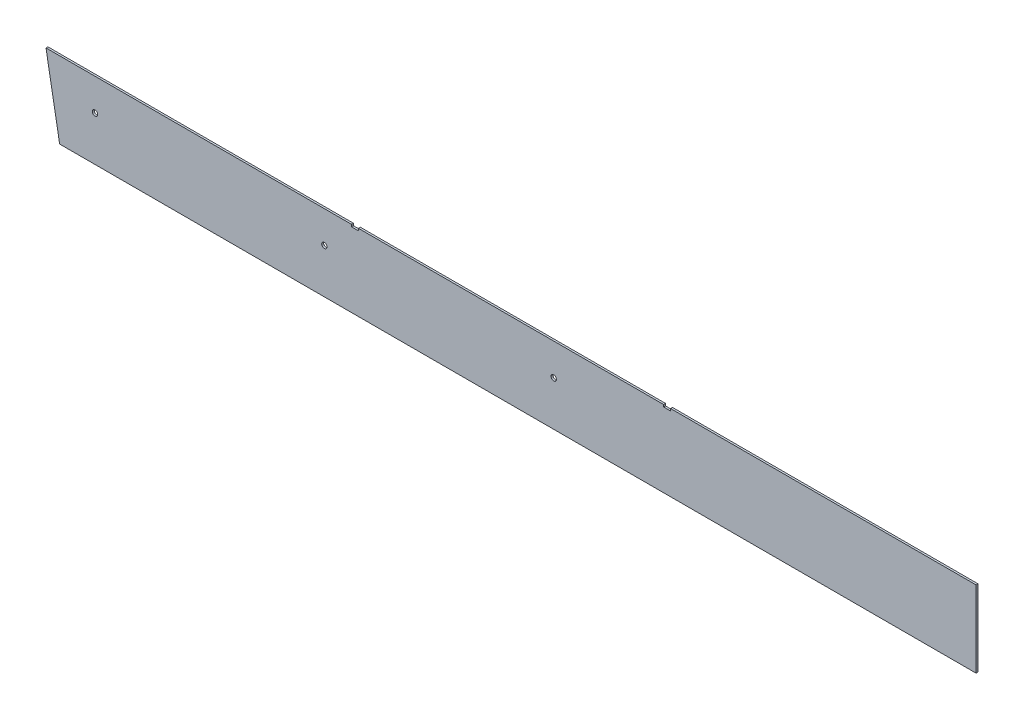
ISO-10303-21;
HEADER;
FILE_DESCRIPTION(('STEP AP214'),'2;1');
FILE_NAME('part.step','',(''),(''),'','','');
FILE_SCHEMA(('AUTOMOTIVE_DESIGN { 1 0 10303 214 1 1 1 1 }'));
ENDSEC;
DATA;
#1=APPLICATION_CONTEXT('core data for automotive mechanical design processes');
#2=APPLICATION_PROTOCOL_DEFINITION('international standard','automotive_design',2000,#1);
#3=PRODUCT_CONTEXT('',#1,'mechanical');
#4=PRODUCT('Part','Part','',(#3));
#5=PRODUCT_RELATED_PRODUCT_CATEGORY('part','',(#4));
#6=PRODUCT_DEFINITION_FORMATION('','',#4);
#7=PRODUCT_DEFINITION_CONTEXT('part definition',#1,'design');
#8=PRODUCT_DEFINITION('design','',#6,#7);
#9=PRODUCT_DEFINITION_SHAPE('','',#8);
#10=(LENGTH_UNIT() NAMED_UNIT(*) SI_UNIT(.MILLI.,.METRE.));
#11=(NAMED_UNIT(*) PLANE_ANGLE_UNIT() SI_UNIT($,.RADIAN.));
#12=(NAMED_UNIT(*) SI_UNIT($,.STERADIAN.) SOLID_ANGLE_UNIT());
#13=UNCERTAINTY_MEASURE_WITH_UNIT(LENGTH_MEASURE(1.E-05),#10,'distance_accuracy_value','');
#14=(GEOMETRIC_REPRESENTATION_CONTEXT(3) GLOBAL_UNCERTAINTY_ASSIGNED_CONTEXT((#13)) GLOBAL_UNIT_ASSIGNED_CONTEXT((#10,
#11,#12)) REPRESENTATION_CONTEXT('',''));
#15=CARTESIAN_POINT('',(0.,0.,0.));
#16=DIRECTION('',(0.,0.,1.));
#17=DIRECTION('',(1.,0.,0.));
#18=AXIS2_PLACEMENT_3D('',#15,#16,#17);
#19=CARTESIAN_POINT('',(-584.25,500.,50.));
#20=DIRECTION('',(0.,-1.,0.));
#21=DIRECTION('',(0.,0.,-1.));
#22=AXIS2_PLACEMENT_3D('',#19,#20,#21);
#23=PLANE('',#22);
#24=DIRECTION('',(0.,0.,1.));
#25=VECTOR('',#24,1.);
#26=CARTESIAN_POINT('',(-224.45,500.,50.));
#27=LINE('',#26,#25);
#28=CARTESIAN_POINT('',(-224.45,500.,0.));
#29=VERTEX_POINT('',#28);
#30=CARTESIAN_POINT('',(-224.45,500.,1.5));
#31=VERTEX_POINT('',#30);
#32=EDGE_CURVE('E213',#29,#31,#27,.T.);
#33=ORIENTED_EDGE('',*,*,#32,.F.);
#34=DIRECTION('',(1.,0.,0.));
#35=VECTOR('',#34,1.);
#36=CARTESIAN_POINT('',(-584.25,500.,0.));
#37=LINE('',#36,#35);
#38=CARTESIAN_POINT('',(-464.25,500.,0.));
#39=VERTEX_POINT('',#38);
#40=EDGE_CURVE('E186',#39,#29,#37,.T.);
#41=ORIENTED_EDGE('',*,*,#40,.F.);
#42=DIRECTION('',(0.,0.,1.));
#43=VECTOR('',#42,1.);
#44=CARTESIAN_POINT('',(-464.25,500.,50.));
#45=LINE('',#44,#43);
#46=CARTESIAN_POINT('',(-464.25,500.,1.5));
#47=VERTEX_POINT('',#46);
#48=EDGE_CURVE('E194',#39,#47,#45,.T.);
#49=ORIENTED_EDGE('',*,*,#48,.T.);
#50=DIRECTION('',(-1.,0.,0.));
#51=VECTOR('',#50,1.);
#52=CARTESIAN_POINT('',(-584.25,500.,1.5));
#53=LINE('',#52,#51);
#54=EDGE_CURVE('E191',#31,#47,#53,.T.);
#55=ORIENTED_EDGE('',*,*,#54,.F.);
#56=EDGE_LOOP('',(#33,#41,#49,#55));
#57=FACE_BOUND('',#56,.T.);
#58=ADVANCED_FACE('F42',(#57),#23,.F.);
#59=DIRECTION('',(0.,0.,-1.));
#60=VECTOR('',#59,1.);
#61=CARTESIAN_POINT('',(-219.05,500.,50.));
#62=LINE('',#61,#60);
#63=CARTESIAN_POINT('',(-219.05,500.,1.5));
#64=VERTEX_POINT('',#63);
#65=CARTESIAN_POINT('',(-219.05,500.,0.));
#66=VERTEX_POINT('',#65);
#67=EDGE_CURVE('E299',#64,#66,#62,.T.);
#68=ORIENTED_EDGE('',*,*,#67,.F.);
#69=CARTESIAN_POINT('',(20.5499999999999,500.,1.5));
#70=VERTEX_POINT('',#69);
#71=EDGE_CURVE('E178',#70,#64,#53,.T.);
#72=ORIENTED_EDGE('',*,*,#71,.F.);
#73=DIRECTION('',(0.,0.,1.));
#74=VECTOR('',#73,1.);
#75=CARTESIAN_POINT('',(20.55,500.,50.));
#76=LINE('',#75,#74);
#77=CARTESIAN_POINT('',(20.5499999999999,500.,0.));
#78=VERTEX_POINT('',#77);
#79=EDGE_CURVE('E297',#78,#70,#76,.T.);
#80=ORIENTED_EDGE('',*,*,#79,.F.);
#81=EDGE_CURVE('E184',#66,#78,#37,.T.);
#82=ORIENTED_EDGE('',*,*,#81,.F.);
#83=EDGE_LOOP('',(#68,#72,#80,#82));
#84=FACE_BOUND('',#83,.T.);
#85=ADVANCED_FACE('F316',(#84),#23,.F.);
#86=DIRECTION('',(0.,0.,-1.));
#87=VECTOR('',#86,1.);
#88=CARTESIAN_POINT('',(25.9499999999999,500.,50.));
#89=LINE('',#88,#87);
#90=CARTESIAN_POINT('',(25.9499999999999,500.,1.5));
#91=VERTEX_POINT('',#90);
#92=CARTESIAN_POINT('',(25.9499999999999,500.,0.));
#93=VERTEX_POINT('',#92);
#94=EDGE_CURVE('E279',#91,#93,#89,.T.);
#95=ORIENTED_EDGE('',*,*,#94,.F.);
#96=CARTESIAN_POINT('',(265.75,500.,1.5));
#97=VERTEX_POINT('',#96);
#98=EDGE_CURVE('E215',#97,#91,#53,.T.);
#99=ORIENTED_EDGE('',*,*,#98,.F.);
#100=DIRECTION('',(0.,0.,-1.));
#101=VECTOR('',#100,1.);
#102=CARTESIAN_POINT('',(265.75,500.,50.));
#103=LINE('',#102,#101);
#104=CARTESIAN_POINT('',(265.75,500.,0.));
#105=VERTEX_POINT('',#104);
#106=EDGE_CURVE('E210',#105,#97,#103,.F.);
#107=ORIENTED_EDGE('',*,*,#106,.F.);
#108=EDGE_CURVE('E46',#93,#105,#37,.T.);
#109=ORIENTED_EDGE('',*,*,#108,.F.);
#110=EDGE_LOOP('',(#95,#99,#107,#109));
#111=FACE_BOUND('',#110,.T.);
#112=ADVANCED_FACE('F270',(#111),#23,.F.);
#113=CARTESIAN_POINT('',(0.,0.,0.));
#114=DIRECTION('',(0.,0.,1.));
#115=DIRECTION('',(1.,0.,0.));
#116=AXIS2_PLACEMENT_3D('',#113,#114,#115);
#117=PLANE('',#116);
#118=CARTESIAN_POINT('',(-65.7499999999999,475.,0.));
#119=DIRECTION('',(0.,0.,-1.));
#120=DIRECTION('',(-1.,0.,0.));
#121=AXIS2_PLACEMENT_3D('',#118,#119,#120);
#122=CIRCLE('',#121,2.09999999999999);
#123=CARTESIAN_POINT('',(-67.8499999999999,475.,0.));
#124=VERTEX_POINT('',#123);
#125=EDGE_CURVE('E244',#124,#124,#122,.T.);
#126=ORIENTED_EDGE('',*,*,#125,.F.);
#127=EDGE_LOOP('',(#126));
#128=FACE_BOUND('',#127,.T.);
#129=CARTESIAN_POINT('',(-245.75,475.,0.));
#130=DIRECTION('',(0.,0.,-1.));
#131=DIRECTION('',(-1.,0.,0.));
#132=AXIS2_PLACEMENT_3D('',#129,#130,#131);
#133=CIRCLE('',#132,2.09999999999999);
#134=CARTESIAN_POINT('',(-247.85,475.,0.));
#135=VERTEX_POINT('',#134);
#136=EDGE_CURVE('E249',#135,#135,#133,.T.);
#137=ORIENTED_EDGE('',*,*,#136,.F.);
#138=EDGE_LOOP('',(#137));
#139=FACE_BOUND('',#138,.T.);
#140=CARTESIAN_POINT('',(-425.75,475.,0.));
#141=DIRECTION('',(0.,0.,-1.));
#142=DIRECTION('',(-1.,0.,0.));
#143=AXIS2_PLACEMENT_3D('',#140,#141,#142);
#144=CIRCLE('',#143,2.09999999999999);
#145=CARTESIAN_POINT('',(-427.85,475.,0.));
#146=VERTEX_POINT('',#145);
#147=EDGE_CURVE('E246',#146,#146,#144,.T.);
#148=ORIENTED_EDGE('',*,*,#147,.F.);
#149=EDGE_LOOP('',(#148));
#150=FACE_BOUND('',#149,.T.);
#151=DIRECTION('',(0.,-1.,0.));
#152=VECTOR('',#151,1.);
#153=CARTESIAN_POINT('',(-224.45,500.2,0.));
#154=LINE('',#153,#152);
#155=CARTESIAN_POINT('',(-224.45,498.3,0.));
#156=VERTEX_POINT('',#155);
#157=EDGE_CURVE('E276',#29,#156,#154,.T.);
#158=ORIENTED_EDGE('',*,*,#157,.T.);
#159=DIRECTION('',(-1.,0.,0.));
#160=VECTOR('',#159,1.);
#161=CARTESIAN_POINT('',(-224.45,498.3,0.));
#162=LINE('',#161,#160);
#163=CARTESIAN_POINT('',(-219.05,498.3,0.));
#164=VERTEX_POINT('',#163);
#165=EDGE_CURVE('E168',#164,#156,#162,.T.);
#166=ORIENTED_EDGE('',*,*,#165,.F.);
#167=DIRECTION('',(0.,-1.,0.));
#168=VECTOR('',#167,1.);
#169=CARTESIAN_POINT('',(-219.05,500.2,0.));
#170=LINE('',#169,#168);
#171=EDGE_CURVE('E166',#66,#164,#170,.T.);
#172=ORIENTED_EDGE('',*,*,#171,.F.);
#173=ORIENTED_EDGE('',*,*,#81,.T.);
#174=DIRECTION('',(0.,-1.,0.));
#175=VECTOR('',#174,1.);
#176=CARTESIAN_POINT('',(20.5499999999999,500.2,0.));
#177=LINE('',#176,#175);
#178=CARTESIAN_POINT('',(20.5499999999999,498.3,0.));
#179=VERTEX_POINT('',#178);
#180=EDGE_CURVE('E291',#78,#179,#177,.T.);
#181=ORIENTED_EDGE('',*,*,#180,.T.);
#182=DIRECTION('',(-1.,0.,0.));
#183=VECTOR('',#182,1.);
#184=CARTESIAN_POINT('',(20.5499999999999,498.3,0.));
#185=LINE('',#184,#183);
#186=CARTESIAN_POINT('',(25.9499999999999,498.3,0.));
#187=VERTEX_POINT('',#186);
#188=EDGE_CURVE('E289',#187,#179,#185,.T.);
#189=ORIENTED_EDGE('',*,*,#188,.F.);
#190=DIRECTION('',(0.,-1.,0.));
#191=VECTOR('',#190,1.);
#192=CARTESIAN_POINT('',(25.9499999999999,500.2,0.));
#193=LINE('',#192,#191);
#194=EDGE_CURVE('E294',#93,#187,#193,.T.);
#195=ORIENTED_EDGE('',*,*,#194,.F.);
#196=ORIENTED_EDGE('',*,*,#108,.T.);
#197=DIRECTION('',(0.,-1.,0.));
#198=VECTOR('',#197,1.);
#199=CARTESIAN_POINT('',(265.75,0.,0.));
#200=LINE('',#199,#198);
#201=CARTESIAN_POINT('',(265.75,440.,0.));
#202=VERTEX_POINT('',#201);
#203=EDGE_CURVE('E202',#105,#202,#200,.T.);
#204=ORIENTED_EDGE('',*,*,#203,.T.);
#205=DIRECTION('',(1.,0.,0.));
#206=VECTOR('',#205,1.);
#207=CARTESIAN_POINT('',(0.,440.,0.));
#208=LINE('',#207,#206);
#209=CARTESIAN_POINT('',(-453.539321881346,440.,0.));
#210=VERTEX_POINT('',#209);
#211=EDGE_CURVE('E192',#210,#202,#208,.T.);
#212=ORIENTED_EDGE('',*,*,#211,.F.);
#213=DIRECTION('',(0.17573327643003,-0.984437817007843,0.));
#214=VECTOR('',#213,1.);
#215=CARTESIAN_POINT('',(-363.413704359279,-64.8734535216678,0.));
#216=LINE('',#215,#214);
#217=EDGE_CURVE('E204',#39,#210,#216,.T.);
#218=ORIENTED_EDGE('',*,*,#217,.F.);
#219=ORIENTED_EDGE('',*,*,#40,.T.);
#220=EDGE_LOOP('',(#158,#166,#172,#173,#181,#189,#195,#196,#204,#212,#218,#219));
#221=FACE_BOUND('',#220,.T.);
#222=ADVANCED_FACE('F267',(#128,#139,#150,#221),#117,.F.);
#223=CARTESIAN_POINT('',(265.75,440.,1.5));
#224=DIRECTION('',(0.,0.,1.));
#225=DIRECTION('',(1.,0.,0.));
#226=AXIS2_PLACEMENT_3D('',#223,#224,#225);
#227=PLANE('',#226);
#228=CARTESIAN_POINT('',(-65.7499999999999,475.,1.5));
#229=DIRECTION('',(0.,0.,-1.));
#230=DIRECTION('',(-1.,0.,0.));
#231=AXIS2_PLACEMENT_3D('',#228,#229,#230);
#232=CIRCLE('',#231,2.09999999999999);
#233=CARTESIAN_POINT('',(-67.8499999999999,475.,1.5));
#234=VERTEX_POINT('',#233);
#235=EDGE_CURVE('E198',#234,#234,#232,.T.);
#236=ORIENTED_EDGE('',*,*,#235,.T.);
#237=EDGE_LOOP('',(#236));
#238=FACE_BOUND('',#237,.T.);
#239=CARTESIAN_POINT('',(-245.75,475.,1.5));
#240=DIRECTION('',(0.,0.,-1.));
#241=DIRECTION('',(-1.,0.,0.));
#242=AXIS2_PLACEMENT_3D('',#239,#240,#241);
#243=CIRCLE('',#242,2.09999999999999);
#244=CARTESIAN_POINT('',(-247.85,475.,1.5));
#245=VERTEX_POINT('',#244);
#246=EDGE_CURVE('E242',#245,#245,#243,.T.);
#247=ORIENTED_EDGE('',*,*,#246,.T.);
#248=EDGE_LOOP('',(#247));
#249=FACE_BOUND('',#248,.T.);
#250=CARTESIAN_POINT('',(-425.75,475.,1.5));
#251=DIRECTION('',(0.,0.,-1.));
#252=DIRECTION('',(-1.,0.,0.));
#253=AXIS2_PLACEMENT_3D('',#250,#251,#252);
#254=CIRCLE('',#253,2.09999999999999);
#255=CARTESIAN_POINT('',(-427.85,475.,1.5));
#256=VERTEX_POINT('',#255);
#257=EDGE_CURVE('E239',#256,#256,#254,.T.);
#258=ORIENTED_EDGE('',*,*,#257,.T.);
#259=EDGE_LOOP('',(#258));
#260=FACE_BOUND('',#259,.T.);
#261=DIRECTION('',(1.,0.,0.));
#262=VECTOR('',#261,1.);
#263=CARTESIAN_POINT('',(-224.45,498.3,1.5));
#264=LINE('',#263,#262);
#265=CARTESIAN_POINT('',(-224.45,498.3,1.5));
#266=VERTEX_POINT('',#265);
#267=CARTESIAN_POINT('',(-219.05,498.3,1.5));
#268=VERTEX_POINT('',#267);
#269=EDGE_CURVE('E169',#266,#268,#264,.T.);
#270=ORIENTED_EDGE('',*,*,#269,.F.);
#271=DIRECTION('',(0.,1.,0.));
#272=VECTOR('',#271,1.);
#273=CARTESIAN_POINT('',(-224.45,440.,1.5));
#274=LINE('',#273,#272);
#275=EDGE_CURVE('E11',#266,#31,#274,.T.);
#276=ORIENTED_EDGE('',*,*,#275,.T.);
#277=ORIENTED_EDGE('',*,*,#54,.T.);
#278=DIRECTION('',(0.17573327643003,-0.984437817007843,0.));
#279=VECTOR('',#278,1.);
#280=CARTESIAN_POINT('',(-431.326096373807,315.564038458867,1.5));
#281=LINE('',#280,#279);
#282=CARTESIAN_POINT('',(-453.539321881346,440.,1.5));
#283=VERTEX_POINT('',#282);
#284=EDGE_CURVE('E199',#47,#283,#281,.T.);
#285=ORIENTED_EDGE('',*,*,#284,.T.);
#286=DIRECTION('',(-1.,0.,0.));
#287=VECTOR('',#286,1.);
#288=CARTESIAN_POINT('',(-453.539321881346,440.,1.5));
#289=LINE('',#288,#287);
#290=CARTESIAN_POINT('',(265.75,440.,1.5));
#291=VERTEX_POINT('',#290);
#292=EDGE_CURVE('E236',#283,#291,#289,.F.);
#293=ORIENTED_EDGE('',*,*,#292,.T.);
#294=DIRECTION('',(0.,-1.,0.));
#295=VECTOR('',#294,1.);
#296=CARTESIAN_POINT('',(265.75,440.,1.5));
#297=LINE('',#296,#295);
#298=EDGE_CURVE('E203',#97,#291,#297,.T.);
#299=ORIENTED_EDGE('',*,*,#298,.F.);
#300=ORIENTED_EDGE('',*,*,#98,.T.);
#301=DIRECTION('',(0.,-1.,0.));
#302=VECTOR('',#301,1.);
#303=CARTESIAN_POINT('',(25.9499999999999,440.,1.5));
#304=LINE('',#303,#302);
#305=CARTESIAN_POINT('',(25.9499999999999,498.3,1.5));
#306=VERTEX_POINT('',#305);
#307=EDGE_CURVE('E181',#91,#306,#304,.T.);
#308=ORIENTED_EDGE('',*,*,#307,.T.);
#309=DIRECTION('',(1.,0.,0.));
#310=VECTOR('',#309,1.);
#311=CARTESIAN_POINT('',(20.5499999999999,498.3,1.5));
#312=LINE('',#311,#310);
#313=CARTESIAN_POINT('',(20.5499999999999,498.3,1.5));
#314=VERTEX_POINT('',#313);
#315=EDGE_CURVE('E284',#314,#306,#312,.T.);
#316=ORIENTED_EDGE('',*,*,#315,.F.);
#317=DIRECTION('',(0.,1.,0.));
#318=VECTOR('',#317,1.);
#319=CARTESIAN_POINT('',(20.5499999999999,440.,1.5));
#320=LINE('',#319,#318);
#321=EDGE_CURVE('E179',#314,#70,#320,.T.);
#322=ORIENTED_EDGE('',*,*,#321,.T.);
#323=ORIENTED_EDGE('',*,*,#71,.T.);
#324=DIRECTION('',(0.,-1.,0.));
#325=VECTOR('',#324,1.);
#326=CARTESIAN_POINT('',(-219.05,440.,1.5));
#327=LINE('',#326,#325);
#328=EDGE_CURVE('E52',#64,#268,#327,.T.);
#329=ORIENTED_EDGE('',*,*,#328,.T.);
#330=EDGE_LOOP('',(#270,#276,#277,#285,#293,#299,#300,#308,#316,#322,#323,#329));
#331=FACE_BOUND('',#330,.T.);
#332=ADVANCED_FACE('F44',(#238,#249,#260,#331),#227,.T.);
#333=CARTESIAN_POINT('',(265.75,440.,1.51010307764118));
#334=DIRECTION('',(-1.,0.,0.));
#335=DIRECTION('',(0.,0.,1.));
#336=AXIS2_PLACEMENT_3D('',#333,#334,#335);
#337=PLANE('',#336);
#338=ORIENTED_EDGE('',*,*,#298,.T.);
#339=DIRECTION('',(0.,0.,-1.));
#340=VECTOR('',#339,1.);
#341=CARTESIAN_POINT('',(265.75,440.,1.5));
#342=LINE('',#341,#340);
#343=EDGE_CURVE('E238',#202,#291,#342,.F.);
#344=ORIENTED_EDGE('',*,*,#343,.F.);
#345=ORIENTED_EDGE('',*,*,#203,.F.);
#346=ORIENTED_EDGE('',*,*,#106,.T.);
#347=EDGE_LOOP('',(#338,#344,#345,#346));
#348=FACE_BOUND('',#347,.T.);
#349=ADVANCED_FACE('F306',(#348),#337,.F.);
#350=CARTESIAN_POINT('',(-453.539321881346,440.,1.51010307764118));
#351=DIRECTION('',(-0.984437817007843,-0.17573327643003,0.));
#352=DIRECTION('',(0.17573327643003,-0.984437817007843,0.));
#353=AXIS2_PLACEMENT_3D('',#350,#351,#352);
#354=PLANE('',#353);
#355=ORIENTED_EDGE('',*,*,#284,.F.);
#356=ORIENTED_EDGE('',*,*,#48,.F.);
#357=ORIENTED_EDGE('',*,*,#217,.T.);
#358=DIRECTION('',(0.,0.,1.));
#359=VECTOR('',#358,1.);
#360=CARTESIAN_POINT('',(-453.539321881346,440.,1.5));
#361=LINE('',#360,#359);
#362=EDGE_CURVE('E207',#210,#283,#361,.T.);
#363=ORIENTED_EDGE('',*,*,#362,.T.);
#364=EDGE_LOOP('',(#355,#356,#357,#363));
#365=FACE_BOUND('',#364,.T.);
#366=ADVANCED_FACE('F231',(#365),#354,.T.);
#367=CARTESIAN_POINT('',(-425.75,475.,0.));
#368=DIRECTION('',(0.,0.,-1.));
#369=DIRECTION('',(-1.,0.,0.));
#370=AXIS2_PLACEMENT_3D('',#367,#368,#369);
#371=CYLINDRICAL_SURFACE('',#370,2.09999999999999);
#372=ORIENTED_EDGE('',*,*,#257,.F.);
#373=EDGE_LOOP('',(#372));
#374=FACE_BOUND('',#373,.T.);
#375=ORIENTED_EDGE('',*,*,#147,.T.);
#376=EDGE_LOOP('',(#375));
#377=FACE_BOUND('',#376,.T.);
#378=ADVANCED_FACE('F321',(#374,#377),#371,.F.);
#379=CARTESIAN_POINT('',(-245.75,475.,0.));
#380=DIRECTION('',(0.,0.,-1.));
#381=DIRECTION('',(-1.,0.,0.));
#382=AXIS2_PLACEMENT_3D('',#379,#380,#381);
#383=CYLINDRICAL_SURFACE('',#382,2.09999999999999);
#384=ORIENTED_EDGE('',*,*,#246,.F.);
#385=EDGE_LOOP('',(#384));
#386=FACE_BOUND('',#385,.T.);
#387=ORIENTED_EDGE('',*,*,#136,.T.);
#388=EDGE_LOOP('',(#387));
#389=FACE_BOUND('',#388,.T.);
#390=ADVANCED_FACE('F263',(#386,#389),#383,.F.);
#391=CARTESIAN_POINT('',(-65.7499999999999,475.,0.));
#392=DIRECTION('',(0.,0.,-1.));
#393=DIRECTION('',(-1.,0.,0.));
#394=AXIS2_PLACEMENT_3D('',#391,#392,#393);
#395=CYLINDRICAL_SURFACE('',#394,2.09999999999999);
#396=ORIENTED_EDGE('',*,*,#235,.F.);
#397=EDGE_LOOP('',(#396));
#398=FACE_BOUND('',#397,.T.);
#399=ORIENTED_EDGE('',*,*,#125,.T.);
#400=EDGE_LOOP('',(#399));
#401=FACE_BOUND('',#400,.T.);
#402=ADVANCED_FACE('F260',(#398,#401),#395,.F.);
#403=CARTESIAN_POINT('',(-453.539321881346,440.,1.5));
#404=DIRECTION('',(0.,1.,0.));
#405=DIRECTION('',(-1.,0.,0.));
#406=AXIS2_PLACEMENT_3D('',#403,#404,#405);
#407=PLANE('',#406);
#408=ORIENTED_EDGE('',*,*,#343,.T.);
#409=ORIENTED_EDGE('',*,*,#292,.F.);
#410=ORIENTED_EDGE('',*,*,#362,.F.);
#411=ORIENTED_EDGE('',*,*,#211,.T.);
#412=EDGE_LOOP('',(#408,#409,#410,#411));
#413=FACE_BOUND('',#412,.T.);
#414=ADVANCED_FACE('F235',(#413),#407,.F.);
#415=CARTESIAN_POINT('',(20.5499999999999,500.2,1.5));
#416=DIRECTION('',(1.,0.,0.));
#417=DIRECTION('',(0.,0.,-1.));
#418=AXIS2_PLACEMENT_3D('',#415,#416,#417);
#419=PLANE('',#418);
#420=ORIENTED_EDGE('',*,*,#79,.T.);
#421=ORIENTED_EDGE('',*,*,#321,.F.);
#422=DIRECTION('',(0.,0.,1.));
#423=VECTOR('',#422,1.);
#424=CARTESIAN_POINT('',(20.5499999999999,498.3,1.5));
#425=LINE('',#424,#423);
#426=EDGE_CURVE('E76',#179,#314,#425,.T.);
#427=ORIENTED_EDGE('',*,*,#426,.F.);
#428=ORIENTED_EDGE('',*,*,#180,.F.);
#429=EDGE_LOOP('',(#420,#421,#427,#428));
#430=FACE_BOUND('',#429,.T.);
#431=ADVANCED_FACE('F318',(#430),#419,.T.);
#432=CARTESIAN_POINT('',(25.9499999999999,500.2,1.5));
#433=DIRECTION('',(-1.,0.,0.));
#434=DIRECTION('',(0.,0.,1.));
#435=AXIS2_PLACEMENT_3D('',#432,#433,#434);
#436=PLANE('',#435);
#437=ORIENTED_EDGE('',*,*,#94,.T.);
#438=ORIENTED_EDGE('',*,*,#194,.T.);
#439=DIRECTION('',(0.,0.,-1.));
#440=VECTOR('',#439,1.);
#441=CARTESIAN_POINT('',(25.9499999999999,498.3,1.5));
#442=LINE('',#441,#440);
#443=EDGE_CURVE('E286',#306,#187,#442,.T.);
#444=ORIENTED_EDGE('',*,*,#443,.F.);
#445=ORIENTED_EDGE('',*,*,#307,.F.);
#446=EDGE_LOOP('',(#437,#438,#444,#445));
#447=FACE_BOUND('',#446,.T.);
#448=ADVANCED_FACE('F310',(#447),#436,.T.);
#449=CARTESIAN_POINT('',(0.,498.3,0.));
#450=DIRECTION('',(0.,-1.,0.));
#451=DIRECTION('',(0.,0.,-1.));
#452=AXIS2_PLACEMENT_3D('',#449,#450,#451);
#453=PLANE('',#452);
#454=ORIENTED_EDGE('',*,*,#426,.T.);
#455=ORIENTED_EDGE('',*,*,#315,.T.);
#456=ORIENTED_EDGE('',*,*,#443,.T.);
#457=ORIENTED_EDGE('',*,*,#188,.T.);
#458=EDGE_LOOP('',(#454,#455,#456,#457));
#459=FACE_BOUND('',#458,.T.);
#460=ADVANCED_FACE('F312',(#459),#453,.F.);
#461=CARTESIAN_POINT('',(-224.45,500.2,1.5));
#462=DIRECTION('',(1.,0.,0.));
#463=DIRECTION('',(0.,0.,-1.));
#464=AXIS2_PLACEMENT_3D('',#461,#462,#463);
#465=PLANE('',#464);
#466=ORIENTED_EDGE('',*,*,#32,.T.);
#467=ORIENTED_EDGE('',*,*,#275,.F.);
#468=DIRECTION('',(0.,0.,1.));
#469=VECTOR('',#468,1.);
#470=CARTESIAN_POINT('',(-224.45,498.3,1.5));
#471=LINE('',#470,#469);
#472=EDGE_CURVE('E64',#156,#266,#471,.T.);
#473=ORIENTED_EDGE('',*,*,#472,.F.);
#474=ORIENTED_EDGE('',*,*,#157,.F.);
#475=EDGE_LOOP('',(#466,#467,#473,#474));
#476=FACE_BOUND('',#475,.T.);
#477=ADVANCED_FACE('F413',(#476),#465,.T.);
#478=CARTESIAN_POINT('',(-219.05,500.2,1.5));
#479=DIRECTION('',(-1.,0.,0.));
#480=DIRECTION('',(0.,0.,1.));
#481=AXIS2_PLACEMENT_3D('',#478,#479,#480);
#482=PLANE('',#481);
#483=ORIENTED_EDGE('',*,*,#67,.T.);
#484=ORIENTED_EDGE('',*,*,#171,.T.);
#485=DIRECTION('',(0.,0.,-1.));
#486=VECTOR('',#485,1.);
#487=CARTESIAN_POINT('',(-219.05,498.3,1.5));
#488=LINE('',#487,#486);
#489=EDGE_CURVE('E161',#268,#164,#488,.T.);
#490=ORIENTED_EDGE('',*,*,#489,.F.);
#491=ORIENTED_EDGE('',*,*,#328,.F.);
#492=EDGE_LOOP('',(#483,#484,#490,#491));
#493=FACE_BOUND('',#492,.T.);
#494=ADVANCED_FACE('F162',(#493),#482,.T.);
#495=CARTESIAN_POINT('',(0.,498.3,0.));
#496=DIRECTION('',(0.,-1.,0.));
#497=DIRECTION('',(0.,0.,-1.));
#498=AXIS2_PLACEMENT_3D('',#495,#496,#497);
#499=PLANE('',#498);
#500=ORIENTED_EDGE('',*,*,#472,.T.);
#501=ORIENTED_EDGE('',*,*,#269,.T.);
#502=ORIENTED_EDGE('',*,*,#489,.T.);
#503=ORIENTED_EDGE('',*,*,#165,.T.);
#504=EDGE_LOOP('',(#500,#501,#502,#503));
#505=FACE_BOUND('',#504,.T.);
#506=ADVANCED_FACE('F172',(#505),#499,.F.);
#507=CLOSED_SHELL('',(#58,#85,#112,#222,#332,#349,#366,#378,#390,#402,#414,#431,#448,#460,#477,
#494,#506));
#508=MANIFOLD_SOLID_BREP('B2',#507);
#509=ADVANCED_BREP_SHAPE_REPRESENTATION('',(#18,#508),#14);
#510=SHAPE_DEFINITION_REPRESENTATION(#9,#509);
ENDSEC;
END-ISO-10303-21;
